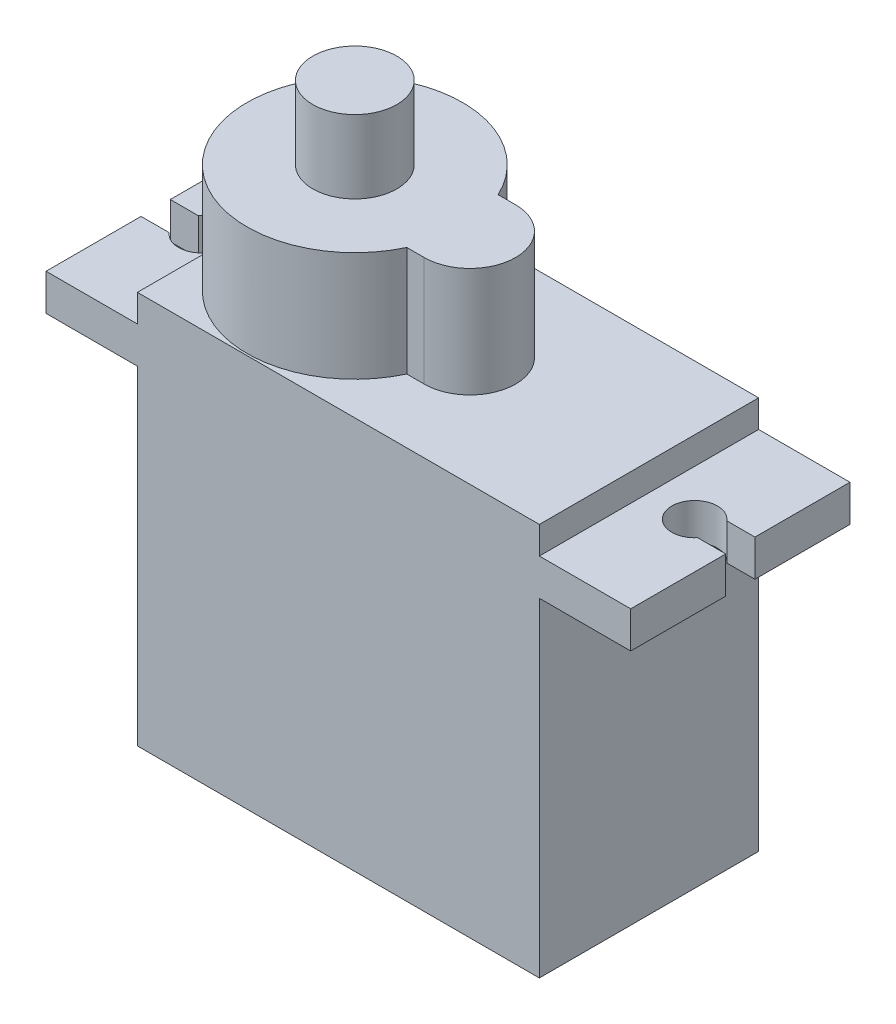
ISO-10303-21;
HEADER;
FILE_DESCRIPTION(('STEP AP214'),'2;1');
FILE_NAME('part.step','',(''),(''),'','','');
FILE_SCHEMA(('AUTOMOTIVE_DESIGN { 1 0 10303 214 1 1 1 1 }'));
ENDSEC;
DATA;
#1=APPLICATION_CONTEXT('core data for automotive mechanical design processes');
#2=APPLICATION_PROTOCOL_DEFINITION('international standard','automotive_design',2000,#1);
#3=PRODUCT_CONTEXT('',#1,'mechanical');
#4=PRODUCT('Part','Part','',(#3));
#5=PRODUCT_RELATED_PRODUCT_CATEGORY('part','',(#4));
#6=PRODUCT_DEFINITION_FORMATION('','',#4);
#7=PRODUCT_DEFINITION_CONTEXT('part definition',#1,'design');
#8=PRODUCT_DEFINITION('design','',#6,#7);
#9=PRODUCT_DEFINITION_SHAPE('','',#8);
#10=(LENGTH_UNIT() NAMED_UNIT(*) SI_UNIT(.MILLI.,.METRE.));
#11=(NAMED_UNIT(*) PLANE_ANGLE_UNIT() SI_UNIT($,.RADIAN.));
#12=(NAMED_UNIT(*) SI_UNIT($,.STERADIAN.) SOLID_ANGLE_UNIT());
#13=UNCERTAINTY_MEASURE_WITH_UNIT(LENGTH_MEASURE(1.E-05),#10,'distance_accuracy_value','');
#14=(GEOMETRIC_REPRESENTATION_CONTEXT(3) GLOBAL_UNCERTAINTY_ASSIGNED_CONTEXT((#13)) GLOBAL_UNIT_ASSIGNED_CONTEXT((#10,
#11,#12)) REPRESENTATION_CONTEXT('',''));
#15=CARTESIAN_POINT('',(0.,0.,0.));
#16=DIRECTION('',(0.,0.,1.));
#17=DIRECTION('',(1.,0.,0.));
#18=AXIS2_PLACEMENT_3D('',#15,#16,#17);
#19=CARTESIAN_POINT('',(27.,20.,12.));
#20=DIRECTION('',(-1.,0.,0.));
#21=DIRECTION('',(0.,0.,1.));
#22=AXIS2_PLACEMENT_3D('',#19,#20,#21);
#23=PLANE('',#22);
#24=DIRECTION('',(0.,1.,0.));
#25=VECTOR('',#24,1.);
#26=CARTESIAN_POINT('',(27.,-0.001000000000001,6.8));
#27=LINE('',#26,#25);
#28=CARTESIAN_POINT('',(27.,18.,6.8));
#29=VERTEX_POINT('',#28);
#30=CARTESIAN_POINT('',(27.,20.,6.8));
#31=VERTEX_POINT('',#30);
#32=EDGE_CURVE('E253',#29,#31,#27,.T.);
#33=ORIENTED_EDGE('',*,*,#32,.T.);
#34=DIRECTION('',(0.,0.,-1.));
#35=VECTOR('',#34,1.);
#36=CARTESIAN_POINT('',(27.,20.,12.));
#37=LINE('',#36,#35);
#38=CARTESIAN_POINT('',(27.,20.,12.));
#39=VERTEX_POINT('',#38);
#40=EDGE_CURVE('E375',#39,#31,#37,.T.);
#41=ORIENTED_EDGE('',*,*,#40,.F.);
#42=DIRECTION('',(0.,1.,0.));
#43=VECTOR('',#42,1.);
#44=CARTESIAN_POINT('',(27.,20.,12.));
#45=LINE('',#44,#43);
#46=CARTESIAN_POINT('',(27.,18.,12.));
#47=VERTEX_POINT('',#46);
#48=EDGE_CURVE('E308',#47,#39,#45,.T.);
#49=ORIENTED_EDGE('',*,*,#48,.F.);
#50=DIRECTION('',(0.,0.,-1.));
#51=VECTOR('',#50,1.);
#52=CARTESIAN_POINT('',(27.,18.,12.));
#53=LINE('',#52,#51);
#54=EDGE_CURVE('E379',#47,#29,#53,.T.);
#55=ORIENTED_EDGE('',*,*,#54,.T.);
#56=EDGE_LOOP('',(#33,#41,#49,#55));
#57=FACE_BOUND('',#56,.T.);
#58=ADVANCED_FACE('F33',(#57),#23,.F.);
#59=CARTESIAN_POINT('',(-5.,18.,12.));
#60=DIRECTION('',(1.,0.,0.));
#61=DIRECTION('',(0.,0.,-1.));
#62=AXIS2_PLACEMENT_3D('',#59,#60,#61);
#63=PLANE('',#62);
#64=DIRECTION('',(0.,1.,0.));
#65=VECTOR('',#64,1.);
#66=CARTESIAN_POINT('',(-5.,-0.001000000000001,5.2));
#67=LINE('',#66,#65);
#68=CARTESIAN_POINT('',(-5.,18.,5.2));
#69=VERTEX_POINT('',#68);
#70=CARTESIAN_POINT('',(-5.,20.,5.2));
#71=VERTEX_POINT('',#70);
#72=EDGE_CURVE('E234',#69,#71,#67,.T.);
#73=ORIENTED_EDGE('',*,*,#72,.T.);
#74=DIRECTION('',(0.,0.,-1.));
#75=VECTOR('',#74,1.);
#76=CARTESIAN_POINT('',(-5.,20.,12.));
#77=LINE('',#76,#75);
#78=CARTESIAN_POINT('',(-5.,20.,0.));
#79=VERTEX_POINT('',#78);
#80=EDGE_CURVE('E357',#71,#79,#77,.T.);
#81=ORIENTED_EDGE('',*,*,#80,.T.);
#82=DIRECTION('',(0.,-1.,0.));
#83=VECTOR('',#82,1.);
#84=CARTESIAN_POINT('',(-5.,18.,0.));
#85=LINE('',#84,#83);
#86=CARTESIAN_POINT('',(-5.,18.,0.));
#87=VERTEX_POINT('',#86);
#88=EDGE_CURVE('E349',#79,#87,#85,.T.);
#89=ORIENTED_EDGE('',*,*,#88,.T.);
#90=DIRECTION('',(0.,0.,-1.));
#91=VECTOR('',#90,1.);
#92=CARTESIAN_POINT('',(-5.,18.,12.));
#93=LINE('',#92,#91);
#94=EDGE_CURVE('E355',#69,#87,#93,.T.);
#95=ORIENTED_EDGE('',*,*,#94,.F.);
#96=EDGE_LOOP('',(#73,#81,#89,#95));
#97=FACE_BOUND('',#96,.T.);
#98=ADVANCED_FACE('F418',(#97),#63,.F.);
#99=CARTESIAN_POINT('',(0.,18.,12.));
#100=DIRECTION('',(1.,0.,0.));
#101=DIRECTION('',(0.,0.,-1.));
#102=AXIS2_PLACEMENT_3D('',#99,#100,#101);
#103=PLANE('',#102);
#104=DIRECTION('',(0.,-1.,0.));
#105=VECTOR('',#104,1.);
#106=CARTESIAN_POINT('',(0.,18.,0.));
#107=LINE('',#106,#105);
#108=CARTESIAN_POINT('',(0.,18.,0.));
#109=VERTEX_POINT('',#108);
#110=CARTESIAN_POINT('',(0.,0.,0.));
#111=VERTEX_POINT('',#110);
#112=EDGE_CURVE('E297',#109,#111,#107,.T.);
#113=ORIENTED_EDGE('',*,*,#112,.T.);
#114=DIRECTION('',(0.,0.,-1.));
#115=VECTOR('',#114,1.);
#116=CARTESIAN_POINT('',(0.,0.,12.));
#117=LINE('',#116,#115);
#118=CARTESIAN_POINT('',(0.,0.,12.));
#119=VERTEX_POINT('',#118);
#120=EDGE_CURVE('E37',#119,#111,#117,.T.);
#121=ORIENTED_EDGE('',*,*,#120,.F.);
#122=DIRECTION('',(0.,-1.,0.));
#123=VECTOR('',#122,1.);
#124=CARTESIAN_POINT('',(0.,18.,12.));
#125=LINE('',#124,#123);
#126=CARTESIAN_POINT('',(0.,18.,12.));
#127=VERTEX_POINT('',#126);
#128=EDGE_CURVE('E298',#127,#119,#125,.T.);
#129=ORIENTED_EDGE('',*,*,#128,.F.);
#130=DIRECTION('',(0.,0.,-1.));
#131=VECTOR('',#130,1.);
#132=CARTESIAN_POINT('',(0.,18.,12.));
#133=LINE('',#132,#131);
#134=EDGE_CURVE('E324',#127,#109,#133,.T.);
#135=ORIENTED_EDGE('',*,*,#134,.T.);
#136=EDGE_LOOP('',(#113,#121,#129,#135));
#137=FACE_BOUND('',#136,.T.);
#138=ADVANCED_FACE('F35',(#137),#103,.F.);
#139=CARTESIAN_POINT('',(0.,0.,12.));
#140=DIRECTION('',(0.,1.,0.));
#141=DIRECTION('',(0.,0.,1.));
#142=AXIS2_PLACEMENT_3D('',#139,#140,#141);
#143=PLANE('',#142);
#144=DIRECTION('',(1.,0.,0.));
#145=VECTOR('',#144,1.);
#146=CARTESIAN_POINT('',(0.,0.,0.));
#147=LINE('',#146,#145);
#148=CARTESIAN_POINT('',(22.,0.,0.));
#149=VERTEX_POINT('',#148);
#150=EDGE_CURVE('E327',#111,#149,#147,.T.);
#151=ORIENTED_EDGE('',*,*,#150,.T.);
#152=DIRECTION('',(0.,0.,-1.));
#153=VECTOR('',#152,1.);
#154=CARTESIAN_POINT('',(22.,0.,12.));
#155=LINE('',#154,#153);
#156=CARTESIAN_POINT('',(22.,0.,12.));
#157=VERTEX_POINT('',#156);
#158=EDGE_CURVE('E384',#157,#149,#155,.T.);
#159=ORIENTED_EDGE('',*,*,#158,.F.);
#160=DIRECTION('',(1.,0.,0.));
#161=VECTOR('',#160,1.);
#162=CARTESIAN_POINT('',(0.,0.,12.));
#163=LINE('',#162,#161);
#164=EDGE_CURVE('E301',#119,#157,#163,.T.);
#165=ORIENTED_EDGE('',*,*,#164,.F.);
#166=ORIENTED_EDGE('',*,*,#120,.T.);
#167=EDGE_LOOP('',(#151,#159,#165,#166));
#168=FACE_BOUND('',#167,.T.);
#169=ADVANCED_FACE('F393',(#168),#143,.F.);
#170=CARTESIAN_POINT('',(22.,18.,12.));
#171=DIRECTION('',(-1.,0.,0.));
#172=DIRECTION('',(0.,-1.,0.));
#173=AXIS2_PLACEMENT_3D('',#170,#171,#172);
#174=PLANE('',#173);
#175=DIRECTION('',(0.,1.,0.));
#176=VECTOR('',#175,1.);
#177=CARTESIAN_POINT('',(22.,18.,0.));
#178=LINE('',#177,#176);
#179=CARTESIAN_POINT('',(22.,18.,0.));
#180=VERTEX_POINT('',#179);
#181=EDGE_CURVE('E329',#149,#180,#178,.T.);
#182=ORIENTED_EDGE('',*,*,#181,.T.);
#183=DIRECTION('',(0.,0.,-1.));
#184=VECTOR('',#183,1.);
#185=CARTESIAN_POINT('',(22.,18.,12.));
#186=LINE('',#185,#184);
#187=CARTESIAN_POINT('',(22.,18.,12.));
#188=VERTEX_POINT('',#187);
#189=EDGE_CURVE('E382',#188,#180,#186,.T.);
#190=ORIENTED_EDGE('',*,*,#189,.F.);
#191=DIRECTION('',(0.,1.,0.));
#192=VECTOR('',#191,1.);
#193=CARTESIAN_POINT('',(22.,18.,12.));
#194=LINE('',#193,#192);
#195=EDGE_CURVE('E304',#157,#188,#194,.T.);
#196=ORIENTED_EDGE('',*,*,#195,.F.);
#197=ORIENTED_EDGE('',*,*,#158,.T.);
#198=EDGE_LOOP('',(#182,#190,#196,#197));
#199=FACE_BOUND('',#198,.T.);
#200=ADVANCED_FACE('F405',(#199),#174,.F.);
#201=CARTESIAN_POINT('',(22.,18.,12.));
#202=DIRECTION('',(0.,1.,0.));
#203=DIRECTION('',(-1.,0.,0.));
#204=AXIS2_PLACEMENT_3D('',#201,#202,#203);
#205=PLANE('',#204);
#206=CARTESIAN_POINT('',(27.,18.,5.2));
#207=VERTEX_POINT('',#206);
#208=CARTESIAN_POINT('',(27.,18.,0.));
#209=VERTEX_POINT('',#208);
#210=EDGE_CURVE('E378',#207,#209,#53,.T.);
#211=ORIENTED_EDGE('',*,*,#210,.F.);
#212=DIRECTION('',(1.,0.,0.));
#213=VECTOR('',#212,1.);
#214=CARTESIAN_POINT('',(0.,18.,5.2));
#215=LINE('',#214,#213);
#216=CARTESIAN_POINT('',(25.4604686356149,18.,5.2));
#217=VERTEX_POINT('',#216);
#218=EDGE_CURVE('E241',#217,#207,#215,.T.);
#219=ORIENTED_EDGE('',*,*,#218,.F.);
#220=CARTESIAN_POINT('',(24.5,18.,6.));
#221=DIRECTION('',(0.,1.,0.));
#222=DIRECTION('',(-1.,0.,0.));
#223=AXIS2_PLACEMENT_3D('',#220,#221,#222);
#224=CIRCLE('',#223,1.25);
#225=CARTESIAN_POINT('',(25.4604686356149,18.,6.8));
#226=VERTEX_POINT('',#225);
#227=EDGE_CURVE('E227',#226,#217,#224,.F.);
#228=ORIENTED_EDGE('',*,*,#227,.F.);
#229=DIRECTION('',(1.,0.,0.));
#230=VECTOR('',#229,1.);
#231=CARTESIAN_POINT('',(0.,18.,6.8));
#232=LINE('',#231,#230);
#233=EDGE_CURVE('E238',#226,#29,#232,.T.);
#234=ORIENTED_EDGE('',*,*,#233,.T.);
#235=ORIENTED_EDGE('',*,*,#54,.F.);
#236=DIRECTION('',(1.,0.,0.));
#237=VECTOR('',#236,1.);
#238=CARTESIAN_POINT('',(22.,18.,12.));
#239=LINE('',#238,#237);
#240=EDGE_CURVE('E306',#188,#47,#239,.T.);
#241=ORIENTED_EDGE('',*,*,#240,.F.);
#242=ORIENTED_EDGE('',*,*,#189,.T.);
#243=DIRECTION('',(1.,0.,0.));
#244=VECTOR('',#243,1.);
#245=CARTESIAN_POINT('',(22.,18.,0.));
#246=LINE('',#245,#244);
#247=EDGE_CURVE('E331',#180,#209,#246,.T.);
#248=ORIENTED_EDGE('',*,*,#247,.T.);
#249=EDGE_LOOP('',(#211,#219,#228,#234,#235,#241,#242,#248));
#250=FACE_BOUND('',#249,.T.);
#251=ADVANCED_FACE('F409',(#250),#205,.F.);
#252=CARTESIAN_POINT('',(27.,20.,5.2));
#253=VERTEX_POINT('',#252);
#254=CARTESIAN_POINT('',(27.,20.,0.));
#255=VERTEX_POINT('',#254);
#256=EDGE_CURVE('E374',#253,#255,#37,.T.);
#257=ORIENTED_EDGE('',*,*,#256,.F.);
#258=DIRECTION('',(0.,1.,0.));
#259=VECTOR('',#258,1.);
#260=CARTESIAN_POINT('',(27.,-0.001000000000001,5.2));
#261=LINE('',#260,#259);
#262=EDGE_CURVE('E251',#207,#253,#261,.T.);
#263=ORIENTED_EDGE('',*,*,#262,.F.);
#264=ORIENTED_EDGE('',*,*,#210,.T.);
#265=DIRECTION('',(0.,1.,0.));
#266=VECTOR('',#265,1.);
#267=CARTESIAN_POINT('',(27.,20.,0.));
#268=LINE('',#267,#266);
#269=EDGE_CURVE('E334',#209,#255,#268,.T.);
#270=ORIENTED_EDGE('',*,*,#269,.T.);
#271=EDGE_LOOP('',(#257,#263,#264,#270));
#272=FACE_BOUND('',#271,.T.);
#273=ADVANCED_FACE('F450',(#272),#23,.F.);
#274=CARTESIAN_POINT('',(22.,20.,12.));
#275=DIRECTION('',(0.,-1.,0.));
#276=DIRECTION('',(0.,0.,-1.));
#277=AXIS2_PLACEMENT_3D('',#274,#275,#276);
#278=PLANE('',#277);
#279=CARTESIAN_POINT('',(24.5,20.,6.));
#280=DIRECTION('',(0.,1.,0.));
#281=DIRECTION('',(0.,0.,1.));
#282=AXIS2_PLACEMENT_3D('',#279,#280,#281);
#283=CIRCLE('',#282,1.25);
#284=CARTESIAN_POINT('',(25.4604686356149,20.,5.2));
#285=VERTEX_POINT('',#284);
#286=CARTESIAN_POINT('',(25.4604686356149,20.,6.8));
#287=VERTEX_POINT('',#286);
#288=EDGE_CURVE('E244',#285,#287,#283,.T.);
#289=ORIENTED_EDGE('',*,*,#288,.F.);
#290=DIRECTION('',(-1.,0.,0.));
#291=VECTOR('',#290,1.);
#292=CARTESIAN_POINT('',(0.,20.,5.2));
#293=LINE('',#292,#291);
#294=EDGE_CURVE('E50',#253,#285,#293,.T.);
#295=ORIENTED_EDGE('',*,*,#294,.F.);
#296=ORIENTED_EDGE('',*,*,#256,.T.);
#297=DIRECTION('',(-1.,0.,0.));
#298=VECTOR('',#297,1.);
#299=CARTESIAN_POINT('',(22.,20.,0.));
#300=LINE('',#299,#298);
#301=CARTESIAN_POINT('',(22.,20.,0.));
#302=VERTEX_POINT('',#301);
#303=EDGE_CURVE('E337',#255,#302,#300,.T.);
#304=ORIENTED_EDGE('',*,*,#303,.T.);
#305=DIRECTION('',(0.,0.,-1.));
#306=VECTOR('',#305,1.);
#307=CARTESIAN_POINT('',(22.,20.,12.));
#308=LINE('',#307,#306);
#309=CARTESIAN_POINT('',(22.,20.,12.));
#310=VERTEX_POINT('',#309);
#311=EDGE_CURVE('E371',#310,#302,#308,.T.);
#312=ORIENTED_EDGE('',*,*,#311,.F.);
#313=DIRECTION('',(-1.,0.,0.));
#314=VECTOR('',#313,1.);
#315=CARTESIAN_POINT('',(22.,20.,12.));
#316=LINE('',#315,#314);
#317=EDGE_CURVE('E310',#39,#310,#316,.T.);
#318=ORIENTED_EDGE('',*,*,#317,.F.);
#319=ORIENTED_EDGE('',*,*,#40,.T.);
#320=DIRECTION('',(-1.,0.,0.));
#321=VECTOR('',#320,1.);
#322=CARTESIAN_POINT('',(0.,20.,6.8));
#323=LINE('',#322,#321);
#324=EDGE_CURVE('E247',#31,#287,#323,.T.);
#325=ORIENTED_EDGE('',*,*,#324,.T.);
#326=EDGE_LOOP('',(#289,#295,#296,#304,#312,#318,#319,#325));
#327=FACE_BOUND('',#326,.T.);
#328=ADVANCED_FACE('F446',(#327),#278,.F.);
#329=CARTESIAN_POINT('',(22.,21.5,12.));
#330=DIRECTION('',(-1.,0.,0.));
#331=DIRECTION('',(0.,0.,1.));
#332=AXIS2_PLACEMENT_3D('',#329,#330,#331);
#333=PLANE('',#332);
#334=DIRECTION('',(0.,1.,0.));
#335=VECTOR('',#334,1.);
#336=CARTESIAN_POINT('',(22.,21.5,0.));
#337=LINE('',#336,#335);
#338=CARTESIAN_POINT('',(22.,21.5,0.));
#339=VERTEX_POINT('',#338);
#340=EDGE_CURVE('E339',#302,#339,#337,.T.);
#341=ORIENTED_EDGE('',*,*,#340,.T.);
#342=DIRECTION('',(0.,0.,-1.));
#343=VECTOR('',#342,1.);
#344=CARTESIAN_POINT('',(22.,21.5,12.));
#345=LINE('',#344,#343);
#346=CARTESIAN_POINT('',(22.,21.5,12.));
#347=VERTEX_POINT('',#346);
#348=EDGE_CURVE('E368',#347,#339,#345,.T.);
#349=ORIENTED_EDGE('',*,*,#348,.F.);
#350=DIRECTION('',(0.,1.,0.));
#351=VECTOR('',#350,1.);
#352=CARTESIAN_POINT('',(22.,21.5,12.));
#353=LINE('',#352,#351);
#354=EDGE_CURVE('E312',#310,#347,#353,.T.);
#355=ORIENTED_EDGE('',*,*,#354,.F.);
#356=ORIENTED_EDGE('',*,*,#311,.T.);
#357=EDGE_LOOP('',(#341,#349,#355,#356));
#358=FACE_BOUND('',#357,.T.);
#359=ADVANCED_FACE('F440',(#358),#333,.F.);
#360=CARTESIAN_POINT('',(0.,21.5,12.));
#361=DIRECTION('',(0.,-1.,0.));
#362=DIRECTION('',(0.,0.,-1.));
#363=AXIS2_PLACEMENT_3D('',#360,#361,#362);
#364=PLANE('',#363);
#365=DIRECTION('',(1.,0.,0.));
#366=VECTOR('',#365,1.);
#367=CARTESIAN_POINT('',(12.2,21.5,8.5));
#368=LINE('',#367,#366);
#369=CARTESIAN_POINT('',(11.244155686355,21.5,8.5));
#370=VERTEX_POINT('',#369);
#371=CARTESIAN_POINT('',(12.2,21.5,8.5));
#372=VERTEX_POINT('',#371);
#373=EDGE_CURVE('E271',#370,#372,#368,.T.);
#374=ORIENTED_EDGE('',*,*,#373,.F.);
#375=CARTESIAN_POINT('',(5.9,21.5,6.));
#376=DIRECTION('',(0.,1.,0.));
#377=DIRECTION('',(0.,0.,1.));
#378=AXIS2_PLACEMENT_3D('',#375,#376,#377);
#379=CIRCLE('',#378,5.9);
#380=CARTESIAN_POINT('',(0.,21.5,6.));
#381=VERTEX_POINT('',#380);
#382=EDGE_CURVE('E11',#381,#370,#379,.T.);
#383=ORIENTED_EDGE('',*,*,#382,.F.);
#384=DIRECTION('',(0.,0.,-1.));
#385=VECTOR('',#384,1.);
#386=CARTESIAN_POINT('',(0.,21.5,12.));
#387=LINE('',#386,#385);
#388=CARTESIAN_POINT('',(0.,21.5,12.));
#389=VERTEX_POINT('',#388);
#390=EDGE_CURVE('E365',#389,#381,#387,.T.);
#391=ORIENTED_EDGE('',*,*,#390,.F.);
#392=DIRECTION('',(-1.,0.,0.));
#393=VECTOR('',#392,1.);
#394=CARTESIAN_POINT('',(0.,21.5,12.));
#395=LINE('',#394,#393);
#396=EDGE_CURVE('E314',#347,#389,#395,.T.);
#397=ORIENTED_EDGE('',*,*,#396,.F.);
#398=ORIENTED_EDGE('',*,*,#348,.T.);
#399=DIRECTION('',(-1.,0.,0.));
#400=VECTOR('',#399,1.);
#401=CARTESIAN_POINT('',(0.,21.5,0.));
#402=LINE('',#401,#400);
#403=CARTESIAN_POINT('',(0.,21.5,0.));
#404=VERTEX_POINT('',#403);
#405=EDGE_CURVE('E341',#339,#404,#402,.T.);
#406=ORIENTED_EDGE('',*,*,#405,.T.);
#407=EDGE_CURVE('E364',#381,#404,#387,.T.);
#408=ORIENTED_EDGE('',*,*,#407,.F.);
#409=CARTESIAN_POINT('',(11.244155686355,21.5,3.5));
#410=VERTEX_POINT('',#409);
#411=EDGE_CURVE('E43',#410,#381,#379,.T.);
#412=ORIENTED_EDGE('',*,*,#411,.F.);
#413=DIRECTION('',(-1.,0.,0.));
#414=VECTOR('',#413,1.);
#415=CARTESIAN_POINT('',(12.2,21.5,3.5));
#416=LINE('',#415,#414);
#417=CARTESIAN_POINT('',(12.2,21.5,3.5));
#418=VERTEX_POINT('',#417);
#419=EDGE_CURVE('E280',#418,#410,#416,.T.);
#420=ORIENTED_EDGE('',*,*,#419,.F.);
#421=CARTESIAN_POINT('',(12.2,21.5,6.));
#422=DIRECTION('',(0.,1.,0.));
#423=DIRECTION('',(0.,0.,1.));
#424=AXIS2_PLACEMENT_3D('',#421,#422,#423);
#425=CIRCLE('',#424,2.5);
#426=EDGE_CURVE('E266',#372,#418,#425,.T.);
#427=ORIENTED_EDGE('',*,*,#426,.F.);
#428=EDGE_LOOP('',(#374,#383,#391,#397,#398,#406,#408,#412,#420,#427));
#429=FACE_BOUND('',#428,.T.);
#430=ADVANCED_FACE('F434',(#429),#364,.F.);
#431=CARTESIAN_POINT('',(0.,20.,12.));
#432=DIRECTION('',(1.,0.,0.));
#433=DIRECTION('',(0.,0.,-1.));
#434=AXIS2_PLACEMENT_3D('',#431,#432,#433);
#435=PLANE('',#434);
#436=DIRECTION('',(0.,-1.,0.));
#437=VECTOR('',#436,1.);
#438=CARTESIAN_POINT('',(0.,20.,0.));
#439=LINE('',#438,#437);
#440=CARTESIAN_POINT('',(0.,20.,0.));
#441=VERTEX_POINT('',#440);
#442=EDGE_CURVE('E344',#404,#441,#439,.T.);
#443=ORIENTED_EDGE('',*,*,#442,.T.);
#444=DIRECTION('',(0.,0.,-1.));
#445=VECTOR('',#444,1.);
#446=CARTESIAN_POINT('',(0.,20.,12.));
#447=LINE('',#446,#445);
#448=CARTESIAN_POINT('',(0.,20.,12.));
#449=VERTEX_POINT('',#448);
#450=EDGE_CURVE('E361',#449,#441,#447,.T.);
#451=ORIENTED_EDGE('',*,*,#450,.F.);
#452=DIRECTION('',(0.,-1.,0.));
#453=VECTOR('',#452,1.);
#454=CARTESIAN_POINT('',(0.,20.,12.));
#455=LINE('',#454,#453);
#456=EDGE_CURVE('E316',#389,#449,#455,.T.);
#457=ORIENTED_EDGE('',*,*,#456,.F.);
#458=ORIENTED_EDGE('',*,*,#390,.T.);
#459=ORIENTED_EDGE('',*,*,#407,.T.);
#460=EDGE_LOOP('',(#443,#451,#457,#458,#459));
#461=FACE_BOUND('',#460,.T.);
#462=ADVANCED_FACE('F430',(#461),#435,.F.);
#463=CARTESIAN_POINT('',(-5.,20.,12.));
#464=DIRECTION('',(0.,-1.,0.));
#465=DIRECTION('',(0.,0.,-1.));
#466=AXIS2_PLACEMENT_3D('',#463,#464,#465);
#467=PLANE('',#466);
#468=CARTESIAN_POINT('',(-2.5,20.,6.));
#469=DIRECTION('',(0.,1.,0.));
#470=DIRECTION('',(0.,0.,1.));
#471=AXIS2_PLACEMENT_3D('',#468,#469,#470);
#472=CIRCLE('',#471,1.25);
#473=CARTESIAN_POINT('',(-3.46046863561493,20.,6.8));
#474=VERTEX_POINT('',#473);
#475=CARTESIAN_POINT('',(-3.46046863561493,20.,5.2));
#476=VERTEX_POINT('',#475);
#477=EDGE_CURVE('E225',#474,#476,#472,.T.);
#478=ORIENTED_EDGE('',*,*,#477,.F.);
#479=DIRECTION('',(1.,0.,0.));
#480=VECTOR('',#479,1.);
#481=CARTESIAN_POINT('',(0.,20.,6.8));
#482=LINE('',#481,#480);
#483=CARTESIAN_POINT('',(-5.,20.,6.8));
#484=VERTEX_POINT('',#483);
#485=EDGE_CURVE('E205',#484,#474,#482,.T.);
#486=ORIENTED_EDGE('',*,*,#485,.F.);
#487=CARTESIAN_POINT('',(-5.,20.,12.));
#488=VERTEX_POINT('',#487);
#489=EDGE_CURVE('E358',#488,#484,#77,.T.);
#490=ORIENTED_EDGE('',*,*,#489,.F.);
#491=DIRECTION('',(-1.,0.,0.));
#492=VECTOR('',#491,1.);
#493=CARTESIAN_POINT('',(-5.,20.,12.));
#494=LINE('',#493,#492);
#495=EDGE_CURVE('E318',#449,#488,#494,.T.);
#496=ORIENTED_EDGE('',*,*,#495,.F.);
#497=ORIENTED_EDGE('',*,*,#450,.T.);
#498=DIRECTION('',(-1.,0.,0.));
#499=VECTOR('',#498,1.);
#500=CARTESIAN_POINT('',(-5.,20.,0.));
#501=LINE('',#500,#499);
#502=EDGE_CURVE('E346',#441,#79,#501,.T.);
#503=ORIENTED_EDGE('',*,*,#502,.T.);
#504=ORIENTED_EDGE('',*,*,#80,.F.);
#505=DIRECTION('',(1.,0.,0.));
#506=VECTOR('',#505,1.);
#507=CARTESIAN_POINT('',(0.,20.,5.2));
#508=LINE('',#507,#506);
#509=EDGE_CURVE('E210',#71,#476,#508,.T.);
#510=ORIENTED_EDGE('',*,*,#509,.T.);
#511=EDGE_LOOP('',(#478,#486,#490,#496,#497,#503,#504,#510));
#512=FACE_BOUND('',#511,.T.);
#513=ADVANCED_FACE('F424',(#512),#467,.F.);
#514=ORIENTED_EDGE('',*,*,#489,.T.);
#515=DIRECTION('',(0.,1.,0.));
#516=VECTOR('',#515,1.);
#517=CARTESIAN_POINT('',(-5.,-0.001000000000001,6.8));
#518=LINE('',#517,#516);
#519=CARTESIAN_POINT('',(-5.,18.,6.8));
#520=VERTEX_POINT('',#519);
#521=EDGE_CURVE('E217',#520,#484,#518,.T.);
#522=ORIENTED_EDGE('',*,*,#521,.F.);
#523=CARTESIAN_POINT('',(-5.,18.,12.));
#524=VERTEX_POINT('',#523);
#525=EDGE_CURVE('E223',#524,#520,#93,.T.);
#526=ORIENTED_EDGE('',*,*,#525,.F.);
#527=DIRECTION('',(0.,-1.,0.));
#528=VECTOR('',#527,1.);
#529=CARTESIAN_POINT('',(-5.,18.,12.));
#530=LINE('',#529,#528);
#531=EDGE_CURVE('E320',#488,#524,#530,.T.);
#532=ORIENTED_EDGE('',*,*,#531,.F.);
#533=EDGE_LOOP('',(#514,#522,#526,#532));
#534=FACE_BOUND('',#533,.T.);
#535=ADVANCED_FACE('F466',(#534),#63,.F.);
#536=CARTESIAN_POINT('',(0.,18.,12.));
#537=DIRECTION('',(0.,1.,0.));
#538=DIRECTION('',(0.,0.,1.));
#539=AXIS2_PLACEMENT_3D('',#536,#537,#538);
#540=PLANE('',#539);
#541=ORIENTED_EDGE('',*,*,#525,.T.);
#542=DIRECTION('',(-1.,0.,0.));
#543=VECTOR('',#542,1.);
#544=CARTESIAN_POINT('',(0.,18.,6.8));
#545=LINE('',#544,#543);
#546=CARTESIAN_POINT('',(-3.46046863561493,18.,6.8));
#547=VERTEX_POINT('',#546);
#548=EDGE_CURVE('E202',#547,#520,#545,.T.);
#549=ORIENTED_EDGE('',*,*,#548,.F.);
#550=CARTESIAN_POINT('',(-2.5,18.,6.));
#551=DIRECTION('',(0.,1.,0.));
#552=DIRECTION('',(0.,0.,1.));
#553=AXIS2_PLACEMENT_3D('',#550,#551,#552);
#554=CIRCLE('',#553,1.25);
#555=CARTESIAN_POINT('',(-3.46046863561493,18.,5.2));
#556=VERTEX_POINT('',#555);
#557=EDGE_CURVE('E213',#556,#547,#554,.F.);
#558=ORIENTED_EDGE('',*,*,#557,.F.);
#559=DIRECTION('',(-1.,0.,0.));
#560=VECTOR('',#559,1.);
#561=CARTESIAN_POINT('',(0.,18.,5.2));
#562=LINE('',#561,#560);
#563=EDGE_CURVE('E58',#556,#69,#562,.T.);
#564=ORIENTED_EDGE('',*,*,#563,.T.);
#565=ORIENTED_EDGE('',*,*,#94,.T.);
#566=DIRECTION('',(1.,0.,0.));
#567=VECTOR('',#566,1.);
#568=CARTESIAN_POINT('',(0.,18.,0.));
#569=LINE('',#568,#567);
#570=EDGE_CURVE('E302',#87,#109,#569,.T.);
#571=ORIENTED_EDGE('',*,*,#570,.T.);
#572=ORIENTED_EDGE('',*,*,#134,.F.);
#573=DIRECTION('',(1.,0.,0.));
#574=VECTOR('',#573,1.);
#575=CARTESIAN_POINT('',(0.,18.,12.));
#576=LINE('',#575,#574);
#577=EDGE_CURVE('E322',#524,#127,#576,.T.);
#578=ORIENTED_EDGE('',*,*,#577,.F.);
#579=EDGE_LOOP('',(#541,#549,#558,#564,#565,#571,#572,#578));
#580=FACE_BOUND('',#579,.T.);
#581=ADVANCED_FACE('F220',(#580),#540,.F.);
#582=CARTESIAN_POINT('',(0.,0.,12.));
#583=DIRECTION('',(0.,0.,1.));
#584=DIRECTION('',(1.,0.,0.));
#585=AXIS2_PLACEMENT_3D('',#582,#583,#584);
#586=PLANE('',#585);
#587=ORIENTED_EDGE('',*,*,#128,.T.);
#588=ORIENTED_EDGE('',*,*,#164,.T.);
#589=ORIENTED_EDGE('',*,*,#195,.T.);
#590=ORIENTED_EDGE('',*,*,#240,.T.);
#591=ORIENTED_EDGE('',*,*,#48,.T.);
#592=ORIENTED_EDGE('',*,*,#317,.T.);
#593=ORIENTED_EDGE('',*,*,#354,.T.);
#594=ORIENTED_EDGE('',*,*,#396,.T.);
#595=ORIENTED_EDGE('',*,*,#456,.T.);
#596=ORIENTED_EDGE('',*,*,#495,.T.);
#597=ORIENTED_EDGE('',*,*,#531,.T.);
#598=ORIENTED_EDGE('',*,*,#577,.T.);
#599=EDGE_LOOP('',(#587,#588,#589,#590,#591,#592,#593,#594,#595,#596,#597,#598));
#600=FACE_BOUND('',#599,.T.);
#601=ADVANCED_FACE('F413',(#600),#586,.T.);
#602=CARTESIAN_POINT('',(0.,0.,0.));
#603=DIRECTION('',(0.,0.,1.));
#604=DIRECTION('',(1.,0.,0.));
#605=AXIS2_PLACEMENT_3D('',#602,#603,#604);
#606=PLANE('',#605);
#607=ORIENTED_EDGE('',*,*,#112,.F.);
#608=ORIENTED_EDGE('',*,*,#570,.F.);
#609=ORIENTED_EDGE('',*,*,#88,.F.);
#610=ORIENTED_EDGE('',*,*,#502,.F.);
#611=ORIENTED_EDGE('',*,*,#442,.F.);
#612=ORIENTED_EDGE('',*,*,#405,.F.);
#613=ORIENTED_EDGE('',*,*,#340,.F.);
#614=ORIENTED_EDGE('',*,*,#303,.F.);
#615=ORIENTED_EDGE('',*,*,#269,.F.);
#616=ORIENTED_EDGE('',*,*,#247,.F.);
#617=ORIENTED_EDGE('',*,*,#181,.F.);
#618=ORIENTED_EDGE('',*,*,#150,.F.);
#619=EDGE_LOOP('',(#607,#608,#609,#610,#611,#612,#613,#614,#615,#616,#617,#618));
#620=FACE_BOUND('',#619,.T.);
#621=ADVANCED_FACE('F400',(#620),#606,.F.);
#622=CARTESIAN_POINT('',(12.2,27.5,6.));
#623=DIRECTION('',(0.,1.,0.));
#624=DIRECTION('',(0.,0.,1.));
#625=AXIS2_PLACEMENT_3D('',#622,#623,#624);
#626=PLANE('',#625);
#627=CARTESIAN_POINT('',(12.2,27.5,6.));
#628=DIRECTION('',(0.,1.,0.));
#629=DIRECTION('',(0.,0.,1.));
#630=AXIS2_PLACEMENT_3D('',#627,#628,#629);
#631=CIRCLE('',#630,2.5);
#632=CARTESIAN_POINT('',(12.2,27.5,8.5));
#633=VERTEX_POINT('',#632);
#634=CARTESIAN_POINT('',(12.2,27.5,3.5));
#635=VERTEX_POINT('',#634);
#636=EDGE_CURVE('E267',#633,#635,#631,.T.);
#637=ORIENTED_EDGE('',*,*,#636,.T.);
#638=DIRECTION('',(-1.,0.,0.));
#639=VECTOR('',#638,1.);
#640=CARTESIAN_POINT('',(12.2,27.5,3.5));
#641=LINE('',#640,#639);
#642=CARTESIAN_POINT('',(11.244155686355,27.5,3.5));
#643=VERTEX_POINT('',#642);
#644=EDGE_CURVE('E270',#635,#643,#641,.T.);
#645=ORIENTED_EDGE('',*,*,#644,.T.);
#646=CARTESIAN_POINT('',(5.9,27.5,6.));
#647=DIRECTION('',(0.,1.,0.));
#648=DIRECTION('',(0.,0.,1.));
#649=AXIS2_PLACEMENT_3D('',#646,#647,#648);
#650=CIRCLE('',#649,5.9);
#651=CARTESIAN_POINT('',(11.244155686355,27.5,8.5));
#652=VERTEX_POINT('',#651);
#653=EDGE_CURVE('E273',#643,#652,#650,.T.);
#654=ORIENTED_EDGE('',*,*,#653,.T.);
#655=DIRECTION('',(1.,0.,0.));
#656=VECTOR('',#655,1.);
#657=CARTESIAN_POINT('',(12.2,27.5,8.5));
#658=LINE('',#657,#656);
#659=EDGE_CURVE('E275',#652,#633,#658,.T.);
#660=ORIENTED_EDGE('',*,*,#659,.T.);
#661=EDGE_LOOP('',(#637,#645,#654,#660));
#662=FACE_BOUND('',#661,.T.);
#663=CARTESIAN_POINT('',(5.9,27.5,6.));
#664=DIRECTION('',(0.,1.,0.));
#665=DIRECTION('',(0.,0.,1.));
#666=AXIS2_PLACEMENT_3D('',#663,#664,#665);
#667=CIRCLE('',#666,2.3);
#668=CARTESIAN_POINT('',(5.9,27.5,8.3));
#669=VERTEX_POINT('',#668);
#670=EDGE_CURVE('E263',#669,#669,#667,.T.);
#671=ORIENTED_EDGE('',*,*,#670,.F.);
#672=EDGE_LOOP('',(#671));
#673=FACE_BOUND('',#672,.T.);
#674=ADVANCED_FACE('F600',(#662,#673),#626,.T.);
#675=CARTESIAN_POINT('',(12.2,27.5,6.));
#676=DIRECTION('',(0.,-1.,0.));
#677=DIRECTION('',(0.,0.,-1.));
#678=AXIS2_PLACEMENT_3D('',#675,#676,#677);
#679=CYLINDRICAL_SURFACE('',#678,2.5);
#680=ORIENTED_EDGE('',*,*,#426,.T.);
#681=DIRECTION('',(0.,-1.,0.));
#682=VECTOR('',#681,1.);
#683=CARTESIAN_POINT('',(12.2,27.5,3.5));
#684=LINE('',#683,#682);
#685=EDGE_CURVE('E294',#635,#418,#684,.T.);
#686=ORIENTED_EDGE('',*,*,#685,.F.);
#687=ORIENTED_EDGE('',*,*,#636,.F.);
#688=DIRECTION('',(0.,-1.,0.));
#689=VECTOR('',#688,1.);
#690=CARTESIAN_POINT('',(12.2,27.5,8.5));
#691=LINE('',#690,#689);
#692=EDGE_CURVE('E277',#633,#372,#691,.T.);
#693=ORIENTED_EDGE('',*,*,#692,.T.);
#694=EDGE_LOOP('',(#680,#686,#687,#693));
#695=FACE_BOUND('',#694,.T.);
#696=ADVANCED_FACE('F603',(#695),#679,.T.);
#697=CARTESIAN_POINT('',(12.2,27.5,3.5));
#698=DIRECTION('',(0.,0.,1.));
#699=DIRECTION('',(1.,0.,0.));
#700=AXIS2_PLACEMENT_3D('',#697,#698,#699);
#701=PLANE('',#700);
#702=ORIENTED_EDGE('',*,*,#419,.T.);
#703=DIRECTION('',(0.,-1.,0.));
#704=VECTOR('',#703,1.);
#705=CARTESIAN_POINT('',(11.244155686355,27.5,3.5));
#706=LINE('',#705,#704);
#707=EDGE_CURVE('E291',#643,#410,#706,.T.);
#708=ORIENTED_EDGE('',*,*,#707,.F.);
#709=ORIENTED_EDGE('',*,*,#644,.F.);
#710=ORIENTED_EDGE('',*,*,#685,.T.);
#711=EDGE_LOOP('',(#702,#708,#709,#710));
#712=FACE_BOUND('',#711,.T.);
#713=ADVANCED_FACE('F611',(#712),#701,.F.);
#714=CARTESIAN_POINT('',(5.9,27.5,6.));
#715=DIRECTION('',(0.,-1.,0.));
#716=DIRECTION('',(0.,0.,-1.));
#717=AXIS2_PLACEMENT_3D('',#714,#715,#716);
#718=CYLINDRICAL_SURFACE('',#717,5.9);
#719=ORIENTED_EDGE('',*,*,#411,.T.);
#720=ORIENTED_EDGE('',*,*,#382,.T.);
#721=DIRECTION('',(0.,-1.,0.));
#722=VECTOR('',#721,1.);
#723=CARTESIAN_POINT('',(11.244155686355,27.5,8.5));
#724=LINE('',#723,#722);
#725=EDGE_CURVE('E288',#652,#370,#724,.T.);
#726=ORIENTED_EDGE('',*,*,#725,.F.);
#727=ORIENTED_EDGE('',*,*,#653,.F.);
#728=ORIENTED_EDGE('',*,*,#707,.T.);
#729=EDGE_LOOP('',(#719,#720,#726,#727,#728));
#730=FACE_BOUND('',#729,.T.);
#731=ADVANCED_FACE('F607',(#730),#718,.T.);
#732=CARTESIAN_POINT('',(12.2,27.5,8.5));
#733=DIRECTION('',(0.,0.,-1.));
#734=DIRECTION('',(-1.,0.,0.));
#735=AXIS2_PLACEMENT_3D('',#732,#733,#734);
#736=PLANE('',#735);
#737=ORIENTED_EDGE('',*,*,#373,.T.);
#738=ORIENTED_EDGE('',*,*,#692,.F.);
#739=ORIENTED_EDGE('',*,*,#659,.F.);
#740=ORIENTED_EDGE('',*,*,#725,.T.);
#741=EDGE_LOOP('',(#737,#738,#739,#740));
#742=FACE_BOUND('',#741,.T.);
#743=ADVANCED_FACE('F598',(#742),#736,.F.);
#744=CARTESIAN_POINT('',(5.9,31.5,6.));
#745=DIRECTION('',(0.,-1.,0.));
#746=DIRECTION('',(0.,0.,-1.));
#747=AXIS2_PLACEMENT_3D('',#744,#745,#746);
#748=CYLINDRICAL_SURFACE('',#747,2.3);
#749=ORIENTED_EDGE('',*,*,#670,.T.);
#750=EDGE_LOOP('',(#749));
#751=FACE_BOUND('',#750,.T.);
#752=CARTESIAN_POINT('',(5.9,31.5,6.));
#753=DIRECTION('',(0.,1.,0.));
#754=DIRECTION('',(0.,0.,1.));
#755=AXIS2_PLACEMENT_3D('',#752,#753,#754);
#756=CIRCLE('',#755,2.3);
#757=CARTESIAN_POINT('',(5.9,31.5,8.3));
#758=VERTEX_POINT('',#757);
#759=EDGE_CURVE('E216',#758,#758,#756,.T.);
#760=ORIENTED_EDGE('',*,*,#759,.F.);
#761=EDGE_LOOP('',(#760));
#762=FACE_BOUND('',#761,.T.);
#763=ADVANCED_FACE('F594',(#751,#762),#748,.T.);
#764=CARTESIAN_POINT('',(5.9,31.5,6.));
#765=DIRECTION('',(0.,1.,0.));
#766=DIRECTION('',(0.,0.,1.));
#767=AXIS2_PLACEMENT_3D('',#764,#765,#766);
#768=PLANE('',#767);
#769=ORIENTED_EDGE('',*,*,#759,.T.);
#770=EDGE_LOOP('',(#769));
#771=FACE_BOUND('',#770,.T.);
#772=ADVANCED_FACE('F547',(#771),#768,.T.);
#773=CARTESIAN_POINT('',(0.,-0.001000000000001,6.8));
#774=DIRECTION('',(0.,0.,1.));
#775=DIRECTION('',(1.,0.,0.));
#776=AXIS2_PLACEMENT_3D('',#773,#774,#775);
#777=PLANE('',#776);
#778=ORIENTED_EDGE('',*,*,#548,.T.);
#779=ORIENTED_EDGE('',*,*,#521,.T.);
#780=ORIENTED_EDGE('',*,*,#485,.T.);
#781=DIRECTION('',(0.,1.,0.));
#782=VECTOR('',#781,1.);
#783=CARTESIAN_POINT('',(-3.46046863561493,-0.001000000000001,6.8));
#784=LINE('',#783,#782);
#785=EDGE_CURVE('E198',#547,#474,#784,.T.);
#786=ORIENTED_EDGE('',*,*,#785,.F.);
#787=EDGE_LOOP('',(#778,#779,#780,#786));
#788=FACE_BOUND('',#787,.T.);
#789=ADVANCED_FACE('F200',(#788),#777,.F.);
#790=CARTESIAN_POINT('',(0.,-0.001000000000001,5.2));
#791=DIRECTION('',(0.,0.,1.));
#792=DIRECTION('',(1.,0.,0.));
#793=AXIS2_PLACEMENT_3D('',#790,#791,#792);
#794=PLANE('',#793);
#795=DIRECTION('',(0.,1.,0.));
#796=VECTOR('',#795,1.);
#797=CARTESIAN_POINT('',(-3.46046863561493,-0.001000000000001,5.2));
#798=LINE('',#797,#796);
#799=EDGE_CURVE('E209',#556,#476,#798,.T.);
#800=ORIENTED_EDGE('',*,*,#799,.T.);
#801=ORIENTED_EDGE('',*,*,#509,.F.);
#802=ORIENTED_EDGE('',*,*,#72,.F.);
#803=ORIENTED_EDGE('',*,*,#563,.F.);
#804=EDGE_LOOP('',(#800,#801,#802,#803));
#805=FACE_BOUND('',#804,.T.);
#806=ADVANCED_FACE('F546',(#805),#794,.T.);
#807=CARTESIAN_POINT('',(-2.5,-0.001000000000001,6.));
#808=DIRECTION('',(0.,1.,0.));
#809=DIRECTION('',(0.,0.,1.));
#810=AXIS2_PLACEMENT_3D('',#807,#808,#809);
#811=CYLINDRICAL_SURFACE('',#810,1.25);
#812=ORIENTED_EDGE('',*,*,#557,.T.);
#813=ORIENTED_EDGE('',*,*,#785,.T.);
#814=ORIENTED_EDGE('',*,*,#477,.T.);
#815=ORIENTED_EDGE('',*,*,#799,.F.);
#816=EDGE_LOOP('',(#812,#813,#814,#815));
#817=FACE_BOUND('',#816,.T.);
#818=ADVANCED_FACE('F214',(#817),#811,.F.);
#819=CARTESIAN_POINT('',(0.,-0.001000000000001,5.2));
#820=DIRECTION('',(0.,0.,-1.));
#821=DIRECTION('',(-1.,0.,0.));
#822=AXIS2_PLACEMENT_3D('',#819,#820,#821);
#823=PLANE('',#822);
#824=ORIENTED_EDGE('',*,*,#218,.T.);
#825=ORIENTED_EDGE('',*,*,#262,.T.);
#826=ORIENTED_EDGE('',*,*,#294,.T.);
#827=DIRECTION('',(0.,1.,0.));
#828=VECTOR('',#827,1.);
#829=CARTESIAN_POINT('',(25.4604686356149,-0.001000000000001,5.2));
#830=LINE('',#829,#828);
#831=EDGE_CURVE('E250',#217,#285,#830,.T.);
#832=ORIENTED_EDGE('',*,*,#831,.F.);
#833=EDGE_LOOP('',(#824,#825,#826,#832));
#834=FACE_BOUND('',#833,.T.);
#835=ADVANCED_FACE('F453',(#834),#823,.F.);
#836=CARTESIAN_POINT('',(0.,-0.001000000000001,6.8));
#837=DIRECTION('',(0.,0.,-1.));
#838=DIRECTION('',(-1.,0.,0.));
#839=AXIS2_PLACEMENT_3D('',#836,#837,#838);
#840=PLANE('',#839);
#841=DIRECTION('',(0.,1.,0.));
#842=VECTOR('',#841,1.);
#843=CARTESIAN_POINT('',(25.4604686356149,-0.001000000000001,6.8));
#844=LINE('',#843,#842);
#845=EDGE_CURVE('E256',#226,#287,#844,.T.);
#846=ORIENTED_EDGE('',*,*,#845,.T.);
#847=ORIENTED_EDGE('',*,*,#324,.F.);
#848=ORIENTED_EDGE('',*,*,#32,.F.);
#849=ORIENTED_EDGE('',*,*,#233,.F.);
#850=EDGE_LOOP('',(#846,#847,#848,#849));
#851=FACE_BOUND('',#850,.T.);
#852=ADVANCED_FACE('F458',(#851),#840,.T.);
#853=CARTESIAN_POINT('',(24.5,-0.001000000000001,6.));
#854=DIRECTION('',(0.,1.,0.));
#855=DIRECTION('',(0.,0.,1.));
#856=AXIS2_PLACEMENT_3D('',#853,#854,#855);
#857=CYLINDRICAL_SURFACE('',#856,1.25);
#858=ORIENTED_EDGE('',*,*,#227,.T.);
#859=ORIENTED_EDGE('',*,*,#831,.T.);
#860=ORIENTED_EDGE('',*,*,#288,.T.);
#861=ORIENTED_EDGE('',*,*,#845,.F.);
#862=EDGE_LOOP('',(#858,#859,#860,#861));
#863=FACE_BOUND('',#862,.T.);
#864=ADVANCED_FACE('F455',(#863),#857,.F.);
#865=CLOSED_SHELL('',(#58,#98,#138,#169,#200,#251,#273,#328,#359,#430,#462,#513,#535,#581,#601,
#621,#674,#696,#713,#731,#743,#763,#772,#789,#806,#818,#835,#852,#864));
#866=MANIFOLD_SOLID_BREP('B2',#865);
#867=ADVANCED_BREP_SHAPE_REPRESENTATION('',(#18,#866),#14);
#868=SHAPE_DEFINITION_REPRESENTATION(#9,#867);
ENDSEC;
END-ISO-10303-21;
